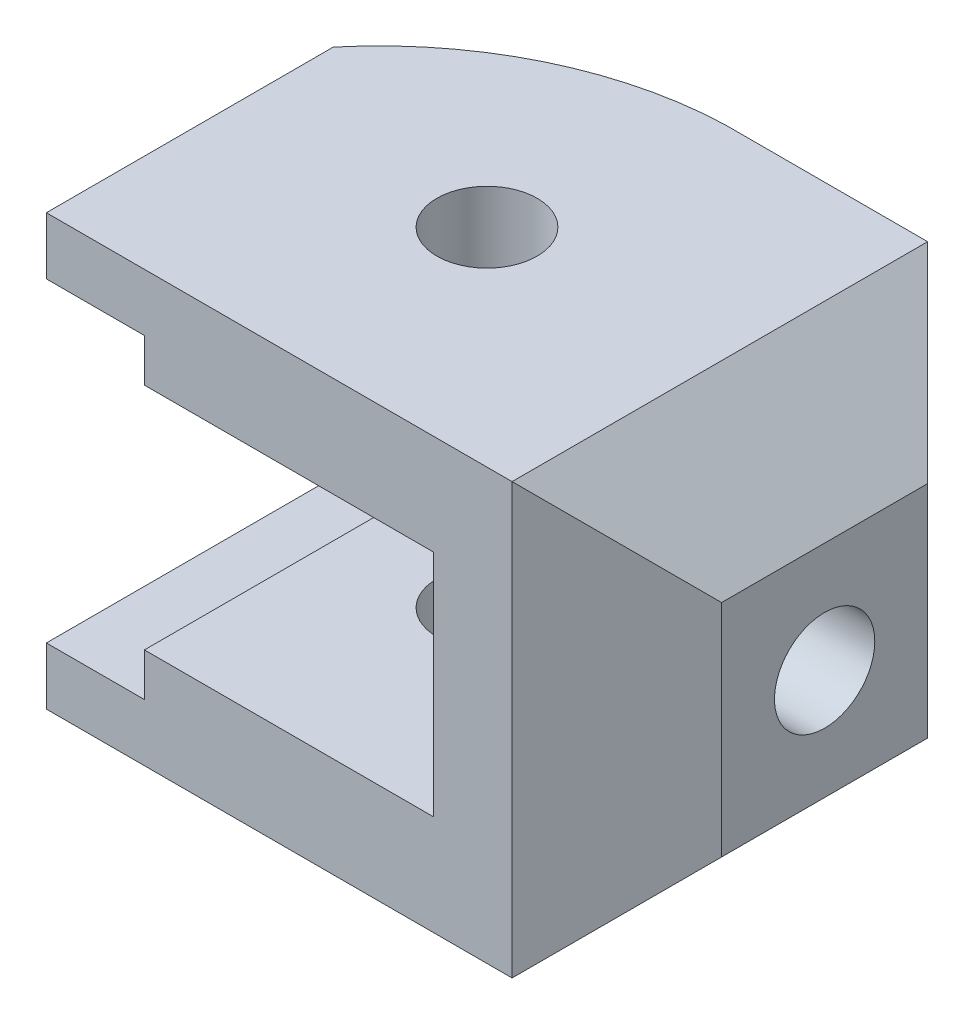
ISO-10303-21;
HEADER;
FILE_DESCRIPTION(('STEP AP214'),'2;1');
FILE_NAME('part.step','',(''),(''),'','','');
FILE_SCHEMA(('AUTOMOTIVE_DESIGN { 1 0 10303 214 1 1 1 1 }'));
ENDSEC;
DATA;
#1=APPLICATION_CONTEXT('core data for automotive mechanical design processes');
#2=APPLICATION_PROTOCOL_DEFINITION('international standard','automotive_design',2000,#1);
#3=PRODUCT_CONTEXT('',#1,'mechanical');
#4=PRODUCT('Part','Part','',(#3));
#5=PRODUCT_RELATED_PRODUCT_CATEGORY('part','',(#4));
#6=PRODUCT_DEFINITION_FORMATION('','',#4);
#7=PRODUCT_DEFINITION_CONTEXT('part definition',#1,'design');
#8=PRODUCT_DEFINITION('design','',#6,#7);
#9=PRODUCT_DEFINITION_SHAPE('','',#8);
#10=(LENGTH_UNIT() NAMED_UNIT(*) SI_UNIT(.MILLI.,.METRE.));
#11=(NAMED_UNIT(*) PLANE_ANGLE_UNIT() SI_UNIT($,.RADIAN.));
#12=(NAMED_UNIT(*) SI_UNIT($,.STERADIAN.) SOLID_ANGLE_UNIT());
#13=UNCERTAINTY_MEASURE_WITH_UNIT(LENGTH_MEASURE(1.E-05),#10,'distance_accuracy_value','');
#14=(GEOMETRIC_REPRESENTATION_CONTEXT(3) GLOBAL_UNCERTAINTY_ASSIGNED_CONTEXT((#13)) GLOBAL_UNIT_ASSIGNED_CONTEXT((#10,
#11,#12)) REPRESENTATION_CONTEXT('',''));
#15=CARTESIAN_POINT('',(0.,0.,0.));
#16=DIRECTION('',(0.,0.,1.));
#17=DIRECTION('',(1.,0.,0.));
#18=AXIS2_PLACEMENT_3D('',#15,#16,#17);
#19=CARTESIAN_POINT('',(65.,0.,58.));
#20=DIRECTION('',(-0.707106781186549,0.707106781186546,0.));
#21=DIRECTION('',(-0.707106781186546,-0.707106781186549,0.));
#22=AXIS2_PLACEMENT_3D('',#19,#20,#21);
#23=PLANE('',#22);
#24=DIRECTION('',(-0.577350269189627,-0.577350269189629,-0.577350269189621));
#25=VECTOR('',#24,1.);
#26=CARTESIAN_POINT('',(84.3333333333332,19.3333333333333,19.333333333333));
#27=LINE('',#26,#25);
#28=CARTESIAN_POINT('',(79.6214177277646,14.6214177277647,14.6214177277644));
#29=VERTEX_POINT('',#28);
#30=CARTESIAN_POINT('',(65.,0.,0.));
#31=VERTEX_POINT('',#30);
#32=EDGE_CURVE('E307',#29,#31,#27,.T.);
#33=ORIENTED_EDGE('',*,*,#32,.F.);
#34=DIRECTION('',(0.,0.,-1.));
#35=VECTOR('',#34,1.);
#36=CARTESIAN_POINT('',(79.6214177277646,14.6214177277647,58.));
#37=LINE('',#36,#35);
#38=CARTESIAN_POINT('',(79.6214177277646,14.6214177277647,43.3785822722356));
#39=VERTEX_POINT('',#38);
#40=EDGE_CURVE('E227',#39,#29,#37,.T.);
#41=ORIENTED_EDGE('',*,*,#40,.F.);
#42=DIRECTION('',(0.577350269189627,0.577350269189629,-0.577350269189621));
#43=VECTOR('',#42,1.);
#44=CARTESIAN_POINT('',(65.,0.,58.));
#45=LINE('',#44,#43);
#46=CARTESIAN_POINT('',(65.,0.,58.));
#47=VERTEX_POINT('',#46);
#48=EDGE_CURVE('E246',#47,#39,#45,.T.);
#49=ORIENTED_EDGE('',*,*,#48,.F.);
#50=DIRECTION('',(0.,0.,-1.));
#51=VECTOR('',#50,1.);
#52=CARTESIAN_POINT('',(65.,0.,58.));
#53=LINE('',#52,#51);
#54=EDGE_CURVE('E230',#47,#31,#53,.T.);
#55=ORIENTED_EDGE('',*,*,#54,.T.);
#56=EDGE_LOOP('',(#33,#41,#49,#55));
#57=FACE_BOUND('',#56,.T.);
#58=ADVANCED_FACE('F39',(#57),#23,.F.);
#59=CARTESIAN_POINT('',(79.6214177277646,14.6214177277647,58.));
#60=DIRECTION('',(-1.,0.,0.));
#61=DIRECTION('',(0.,0.,1.));
#62=AXIS2_PLACEMENT_3D('',#59,#60,#61);
#63=PLANE('',#62);
#64=CARTESIAN_POINT('',(79.6214177277646,30.,29.));
#65=DIRECTION('',(1.,0.,0.));
#66=DIRECTION('',(0.,0.,-1.));
#67=AXIS2_PLACEMENT_3D('',#64,#65,#66);
#68=CIRCLE('',#67,7.);
#69=CARTESIAN_POINT('',(79.6214177277646,30.,22.));
#70=VERTEX_POINT('',#69);
#71=EDGE_CURVE('E182',#70,#70,#68,.T.);
#72=ORIENTED_EDGE('',*,*,#71,.F.);
#73=EDGE_LOOP('',(#72));
#74=FACE_BOUND('',#73,.T.);
#75=DIRECTION('',(0.,-1.,0.));
#76=VECTOR('',#75,1.);
#77=CARTESIAN_POINT('',(79.6214177277646,60.,14.6214177277644));
#78=LINE('',#77,#76);
#79=CARTESIAN_POINT('',(79.6214177277646,45.3785822722354,14.6214177277644));
#80=VERTEX_POINT('',#79);
#81=EDGE_CURVE('E299',#80,#29,#78,.T.);
#82=ORIENTED_EDGE('',*,*,#81,.F.);
#83=DIRECTION('',(0.,0.,-1.));
#84=VECTOR('',#83,1.);
#85=CARTESIAN_POINT('',(79.6214177277646,45.3785822722354,58.));
#86=LINE('',#85,#84);
#87=CARTESIAN_POINT('',(79.6214177277646,45.3785822722354,43.3785822722356));
#88=VERTEX_POINT('',#87);
#89=EDGE_CURVE('E224',#88,#80,#86,.T.);
#90=ORIENTED_EDGE('',*,*,#89,.F.);
#91=DIRECTION('',(0.,-1.,0.));
#92=VECTOR('',#91,1.);
#93=CARTESIAN_POINT('',(79.6214177277646,60.,43.3785822722356));
#94=LINE('',#93,#92);
#95=EDGE_CURVE('E297',#88,#39,#94,.T.);
#96=ORIENTED_EDGE('',*,*,#95,.T.);
#97=ORIENTED_EDGE('',*,*,#40,.T.);
#98=EDGE_LOOP('',(#82,#90,#96,#97));
#99=FACE_BOUND('',#98,.T.);
#100=ADVANCED_FACE('F319',(#74,#99),#63,.F.);
#101=CARTESIAN_POINT('',(79.6214177277646,45.3785822722354,58.));
#102=DIRECTION('',(-0.707106781186549,-0.707106781186546,0.));
#103=DIRECTION('',(0.707106781186546,-0.707106781186549,0.));
#104=AXIS2_PLACEMENT_3D('',#101,#102,#103);
#105=PLANE('',#104);
#106=DIRECTION('',(0.577350269189627,-0.577350269189629,0.577350269189621));
#107=VECTOR('',#106,1.);
#108=CARTESIAN_POINT('',(94.0809451518431,30.9190548481569,29.0809451518427));
#109=LINE('',#108,#107);
#110=CARTESIAN_POINT('',(65.,60.,0.));
#111=VERTEX_POINT('',#110);
#112=EDGE_CURVE('E302',#111,#80,#109,.T.);
#113=ORIENTED_EDGE('',*,*,#112,.F.);
#114=DIRECTION('',(0.,0.,-1.));
#115=VECTOR('',#114,1.);
#116=CARTESIAN_POINT('',(65.,60.,58.));
#117=LINE('',#116,#115);
#118=CARTESIAN_POINT('',(65.,60.,58.));
#119=VERTEX_POINT('',#118);
#120=EDGE_CURVE('E221',#119,#111,#117,.T.);
#121=ORIENTED_EDGE('',*,*,#120,.F.);
#122=DIRECTION('',(-0.577350269189627,0.577350269189629,0.577350269189621));
#123=VECTOR('',#122,1.);
#124=CARTESIAN_POINT('',(74.7476118185098,50.2523881814902,48.2523881814903));
#125=LINE('',#124,#123);
#126=EDGE_CURVE('E308',#88,#119,#125,.T.);
#127=ORIENTED_EDGE('',*,*,#126,.F.);
#128=ORIENTED_EDGE('',*,*,#89,.T.);
#129=EDGE_LOOP('',(#113,#121,#127,#128));
#130=FACE_BOUND('',#129,.T.);
#131=ADVANCED_FACE('F325',(#130),#105,.F.);
#132=CARTESIAN_POINT('',(0.,0.,58.));
#133=DIRECTION('',(0.,0.,1.));
#134=DIRECTION('',(1.,0.,0.));
#135=AXIS2_PLACEMENT_3D('',#132,#133,#134);
#136=PLANE('',#135);
#137=DIRECTION('',(1.,0.,0.));
#138=VECTOR('',#137,1.);
#139=CARTESIAN_POINT('',(0.,0.,58.));
#140=LINE('',#139,#138);
#141=CARTESIAN_POINT('',(0.,0.,58.));
#142=VERTEX_POINT('',#141);
#143=EDGE_CURVE('E255',#142,#47,#140,.T.);
#144=ORIENTED_EDGE('',*,*,#143,.T.);
#145=DIRECTION('',(0.,-1.,0.));
#146=VECTOR('',#145,1.);
#147=CARTESIAN_POINT('',(65.,60.,58.));
#148=LINE('',#147,#146);
#149=EDGE_CURVE('E300',#119,#47,#148,.T.);
#150=ORIENTED_EDGE('',*,*,#149,.F.);
#151=DIRECTION('',(-1.,0.,0.));
#152=VECTOR('',#151,1.);
#153=CARTESIAN_POINT('',(65.,60.,58.));
#154=LINE('',#153,#152);
#155=CARTESIAN_POINT('',(0.,60.,58.));
#156=VERTEX_POINT('',#155);
#157=EDGE_CURVE('E258',#119,#156,#154,.T.);
#158=ORIENTED_EDGE('',*,*,#157,.T.);
#159=DIRECTION('',(0.,-1.,0.));
#160=VECTOR('',#159,1.);
#161=CARTESIAN_POINT('',(0.,60.,58.));
#162=LINE('',#161,#160);
#163=CARTESIAN_POINT('',(0.,52.,58.));
#164=VERTEX_POINT('',#163);
#165=EDGE_CURVE('E260',#156,#164,#162,.T.);
#166=ORIENTED_EDGE('',*,*,#165,.T.);
#167=DIRECTION('',(1.,0.,0.));
#168=VECTOR('',#167,1.);
#169=CARTESIAN_POINT('',(0.,52.,58.));
#170=LINE('',#169,#168);
#171=CARTESIAN_POINT('',(13.6860147119175,52.,58.));
#172=VERTEX_POINT('',#171);
#173=EDGE_CURVE('E262',#164,#172,#170,.T.);
#174=ORIENTED_EDGE('',*,*,#173,.T.);
#175=DIRECTION('',(0.,-1.,0.));
#176=VECTOR('',#175,1.);
#177=CARTESIAN_POINT('',(13.6860147119175,52.,58.));
#178=LINE('',#177,#176);
#179=CARTESIAN_POINT('',(13.6860147119175,46.,58.));
#180=VERTEX_POINT('',#179);
#181=EDGE_CURVE('E264',#172,#180,#178,.T.);
#182=ORIENTED_EDGE('',*,*,#181,.T.);
#183=DIRECTION('',(1.,0.,0.));
#184=VECTOR('',#183,1.);
#185=CARTESIAN_POINT('',(13.6860147119175,46.,58.));
#186=LINE('',#185,#184);
#187=CARTESIAN_POINT('',(54.,46.,58.));
#188=VERTEX_POINT('',#187);
#189=EDGE_CURVE('E266',#180,#188,#186,.T.);
#190=ORIENTED_EDGE('',*,*,#189,.T.);
#191=DIRECTION('',(0.,-1.,0.));
#192=VECTOR('',#191,1.);
#193=CARTESIAN_POINT('',(54.,46.,58.));
#194=LINE('',#193,#192);
#195=CARTESIAN_POINT('',(54.,14.,58.));
#196=VERTEX_POINT('',#195);
#197=EDGE_CURVE('E268',#188,#196,#194,.T.);
#198=ORIENTED_EDGE('',*,*,#197,.T.);
#199=DIRECTION('',(-1.,0.,0.));
#200=VECTOR('',#199,1.);
#201=CARTESIAN_POINT('',(54.,14.,58.));
#202=LINE('',#201,#200);
#203=CARTESIAN_POINT('',(13.6860147119175,14.,58.));
#204=VERTEX_POINT('',#203);
#205=EDGE_CURVE('E270',#196,#204,#202,.T.);
#206=ORIENTED_EDGE('',*,*,#205,.T.);
#207=DIRECTION('',(0.,-1.,0.));
#208=VECTOR('',#207,1.);
#209=CARTESIAN_POINT('',(13.6860147119175,14.,58.));
#210=LINE('',#209,#208);
#211=CARTESIAN_POINT('',(13.6860147119175,8.,58.));
#212=VERTEX_POINT('',#211);
#213=EDGE_CURVE('E271',#204,#212,#210,.T.);
#214=ORIENTED_EDGE('',*,*,#213,.T.);
#215=DIRECTION('',(-1.,0.,0.));
#216=VECTOR('',#215,1.);
#217=CARTESIAN_POINT('',(13.6860147119175,8.,58.));
#218=LINE('',#217,#216);
#219=CARTESIAN_POINT('',(0.,8.,58.));
#220=VERTEX_POINT('',#219);
#221=EDGE_CURVE('E185',#212,#220,#218,.T.);
#222=ORIENTED_EDGE('',*,*,#221,.T.);
#223=DIRECTION('',(0.,-1.,0.));
#224=VECTOR('',#223,1.);
#225=CARTESIAN_POINT('',(0.,8.,58.));
#226=LINE('',#225,#224);
#227=EDGE_CURVE('E193',#220,#142,#226,.T.);
#228=ORIENTED_EDGE('',*,*,#227,.T.);
#229=EDGE_LOOP('',(#144,#150,#158,#166,#174,#182,#190,#198,#206,#214,#222,#228));
#230=FACE_BOUND('',#229,.T.);
#231=ADVANCED_FACE('F277',(#230),#136,.T.);
#232=CARTESIAN_POINT('',(0.,0.,0.));
#233=DIRECTION('',(0.,0.,1.));
#234=DIRECTION('',(1.,0.,0.));
#235=AXIS2_PLACEMENT_3D('',#232,#233,#234);
#236=PLANE('',#235);
#237=DIRECTION('',(1.,0.,0.));
#238=VECTOR('',#237,1.);
#239=CARTESIAN_POINT('',(0.,0.,0.));
#240=LINE('',#239,#238);
#241=CARTESIAN_POINT('',(36.7163562797106,0.,0.));
#242=VERTEX_POINT('',#241);
#243=EDGE_CURVE('E165',#242,#31,#240,.T.);
#244=ORIENTED_EDGE('',*,*,#243,.F.);
#245=DIRECTION('',(0.,1.,0.));
#246=VECTOR('',#245,1.);
#247=CARTESIAN_POINT('',(36.7163562797106,0.,0.));
#248=LINE('',#247,#246);
#249=CARTESIAN_POINT('',(36.7163562797106,14.,0.));
#250=VERTEX_POINT('',#249);
#251=EDGE_CURVE('E149',#242,#250,#248,.T.);
#252=ORIENTED_EDGE('',*,*,#251,.T.);
#253=DIRECTION('',(-1.,0.,0.));
#254=VECTOR('',#253,1.);
#255=CARTESIAN_POINT('',(54.,14.,0.));
#256=LINE('',#255,#254);
#257=CARTESIAN_POINT('',(54.,14.,0.));
#258=VERTEX_POINT('',#257);
#259=EDGE_CURVE('E191',#258,#250,#256,.T.);
#260=ORIENTED_EDGE('',*,*,#259,.F.);
#261=DIRECTION('',(0.,-1.,0.));
#262=VECTOR('',#261,1.);
#263=CARTESIAN_POINT('',(54.,46.,0.));
#264=LINE('',#263,#262);
#265=CARTESIAN_POINT('',(54.,46.,0.));
#266=VERTEX_POINT('',#265);
#267=EDGE_CURVE('E189',#266,#258,#264,.T.);
#268=ORIENTED_EDGE('',*,*,#267,.F.);
#269=DIRECTION('',(1.,0.,0.));
#270=VECTOR('',#269,1.);
#271=CARTESIAN_POINT('',(13.6860147119175,46.,0.));
#272=LINE('',#271,#270);
#273=CARTESIAN_POINT('',(36.7163562797106,46.,0.));
#274=VERTEX_POINT('',#273);
#275=EDGE_CURVE('E179',#274,#266,#272,.T.);
#276=ORIENTED_EDGE('',*,*,#275,.F.);
#277=CARTESIAN_POINT('',(36.7163562797106,60.,0.));
#278=VERTEX_POINT('',#277);
#279=EDGE_CURVE('E54',#274,#278,#248,.T.);
#280=ORIENTED_EDGE('',*,*,#279,.T.);
#281=DIRECTION('',(-1.,0.,0.));
#282=VECTOR('',#281,1.);
#283=CARTESIAN_POINT('',(65.,60.,0.));
#284=LINE('',#283,#282);
#285=EDGE_CURVE('E175',#111,#278,#284,.T.);
#286=ORIENTED_EDGE('',*,*,#285,.F.);
#287=DIRECTION('',(0.,-1.,0.));
#288=VECTOR('',#287,1.);
#289=CARTESIAN_POINT('',(65.,60.,0.));
#290=LINE('',#289,#288);
#291=EDGE_CURVE('E173',#111,#31,#290,.T.);
#292=ORIENTED_EDGE('',*,*,#291,.T.);
#293=EDGE_LOOP('',(#244,#252,#260,#268,#276,#280,#286,#292));
#294=FACE_BOUND('',#293,.T.);
#295=ADVANCED_FACE('F171',(#294),#236,.F.);
#296=CARTESIAN_POINT('',(0.,8.,58.));
#297=DIRECTION('',(1.,0.,0.));
#298=DIRECTION('',(0.,1.,0.));
#299=AXIS2_PLACEMENT_3D('',#296,#297,#298);
#300=PLANE('',#299);
#301=DIRECTION('',(0.,0.,-1.));
#302=VECTOR('',#301,1.);
#303=CARTESIAN_POINT('',(0.,8.,58.));
#304=LINE('',#303,#302);
#305=CARTESIAN_POINT('',(0.,8.,17.9548803592759));
#306=VERTEX_POINT('',#305);
#307=EDGE_CURVE('E194',#220,#306,#304,.T.);
#308=ORIENTED_EDGE('',*,*,#307,.T.);
#309=DIRECTION('',(0.,1.,0.));
#310=VECTOR('',#309,1.);
#311=CARTESIAN_POINT('',(0.,0.,17.9548803592758));
#312=LINE('',#311,#310);
#313=CARTESIAN_POINT('',(0.,0.,17.9548803592758));
#314=VERTEX_POINT('',#313);
#315=EDGE_CURVE('E62',#314,#306,#312,.T.);
#316=ORIENTED_EDGE('',*,*,#315,.F.);
#317=DIRECTION('',(0.,0.,-1.));
#318=VECTOR('',#317,1.);
#319=CARTESIAN_POINT('',(0.,0.,58.));
#320=LINE('',#319,#318);
#321=EDGE_CURVE('E47',#142,#314,#320,.T.);
#322=ORIENTED_EDGE('',*,*,#321,.F.);
#323=ORIENTED_EDGE('',*,*,#227,.F.);
#324=EDGE_LOOP('',(#308,#316,#322,#323));
#325=FACE_BOUND('',#324,.T.);
#326=ADVANCED_FACE('F41',(#325),#300,.F.);
#327=CARTESIAN_POINT('',(0.,0.,58.));
#328=DIRECTION('',(0.,1.,0.));
#329=DIRECTION('',(0.,0.,1.));
#330=AXIS2_PLACEMENT_3D('',#327,#328,#329);
#331=PLANE('',#330);
#332=CARTESIAN_POINT('',(32.5,0.,29.));
#333=DIRECTION('',(0.,1.,0.));
#334=DIRECTION('',(-1.,0.,0.));
#335=AXIS2_PLACEMENT_3D('',#332,#333,#334);
#336=CIRCLE('',#335,7.);
#337=CARTESIAN_POINT('',(25.5,0.,29.));
#338=VERTEX_POINT('',#337);
#339=EDGE_CURVE('E235',#338,#338,#336,.T.);
#340=ORIENTED_EDGE('',*,*,#339,.T.);
#341=EDGE_LOOP('',(#340));
#342=FACE_BOUND('',#341,.T.);
#343=ORIENTED_EDGE('',*,*,#321,.T.);
#344=CARTESIAN_POINT('',(38.4049133849402,0.,49.9714796149001));
#345=DIRECTION('',(0.,-1.,0.));
#346=DIRECTION('',(1.,0.,0.));
#347=AXIS2_PLACEMENT_3D('',#344,#345,#346);
#348=CIRCLE('',#347,50.);
#349=EDGE_CURVE('E152',#314,#242,#348,.T.);
#350=ORIENTED_EDGE('',*,*,#349,.T.);
#351=ORIENTED_EDGE('',*,*,#243,.T.);
#352=ORIENTED_EDGE('',*,*,#54,.F.);
#353=ORIENTED_EDGE('',*,*,#143,.F.);
#354=EDGE_LOOP('',(#343,#350,#351,#352,#353));
#355=FACE_BOUND('',#354,.T.);
#356=ADVANCED_FACE('F163',(#342,#355),#331,.F.);
#357=CARTESIAN_POINT('',(65.,60.,58.));
#358=DIRECTION('',(0.,-1.,0.));
#359=DIRECTION('',(1.,0.,0.));
#360=AXIS2_PLACEMENT_3D('',#357,#358,#359);
#361=PLANE('',#360);
#362=CARTESIAN_POINT('',(32.5,60.,29.));
#363=DIRECTION('',(0.,1.,0.));
#364=DIRECTION('',(-1.,0.,0.));
#365=AXIS2_PLACEMENT_3D('',#362,#363,#364);
#366=CIRCLE('',#365,7.);
#367=CARTESIAN_POINT('',(25.5,60.,29.));
#368=VERTEX_POINT('',#367);
#369=EDGE_CURVE('E241',#368,#368,#366,.T.);
#370=ORIENTED_EDGE('',*,*,#369,.F.);
#371=EDGE_LOOP('',(#370));
#372=FACE_BOUND('',#371,.T.);
#373=ORIENTED_EDGE('',*,*,#285,.T.);
#374=CARTESIAN_POINT('',(38.4049133849402,60.,49.9714796149001));
#375=DIRECTION('',(0.,-1.,0.));
#376=DIRECTION('',(1.,0.,0.));
#377=AXIS2_PLACEMENT_3D('',#374,#375,#376);
#378=CIRCLE('',#377,50.);
#379=CARTESIAN_POINT('',(0.,60.,17.9548803592758));
#380=VERTEX_POINT('',#379);
#381=EDGE_CURVE('E168',#380,#278,#378,.T.);
#382=ORIENTED_EDGE('',*,*,#381,.F.);
#383=DIRECTION('',(0.,0.,-1.));
#384=VECTOR('',#383,1.);
#385=CARTESIAN_POINT('',(0.,60.,58.));
#386=LINE('',#385,#384);
#387=EDGE_CURVE('E218',#156,#380,#386,.T.);
#388=ORIENTED_EDGE('',*,*,#387,.F.);
#389=ORIENTED_EDGE('',*,*,#157,.F.);
#390=ORIENTED_EDGE('',*,*,#120,.T.);
#391=EDGE_LOOP('',(#373,#382,#388,#389,#390));
#392=FACE_BOUND('',#391,.T.);
#393=ADVANCED_FACE('F330',(#372,#392),#361,.F.);
#394=CARTESIAN_POINT('',(0.,60.,58.));
#395=DIRECTION('',(1.,0.,0.));
#396=DIRECTION('',(0.,1.,0.));
#397=AXIS2_PLACEMENT_3D('',#394,#395,#396);
#398=PLANE('',#397);
#399=ORIENTED_EDGE('',*,*,#387,.T.);
#400=CARTESIAN_POINT('',(0.,52.,17.9548803592758));
#401=VERTEX_POINT('',#400);
#402=EDGE_CURVE('E159',#401,#380,#312,.T.);
#403=ORIENTED_EDGE('',*,*,#402,.F.);
#404=DIRECTION('',(0.,0.,-1.));
#405=VECTOR('',#404,1.);
#406=CARTESIAN_POINT('',(0.,52.,58.));
#407=LINE('',#406,#405);
#408=EDGE_CURVE('E215',#164,#401,#407,.T.);
#409=ORIENTED_EDGE('',*,*,#408,.F.);
#410=ORIENTED_EDGE('',*,*,#165,.F.);
#411=EDGE_LOOP('',(#399,#403,#409,#410));
#412=FACE_BOUND('',#411,.T.);
#413=ADVANCED_FACE('F338',(#412),#398,.F.);
#414=CARTESIAN_POINT('',(0.,52.,58.));
#415=DIRECTION('',(0.,1.,0.));
#416=DIRECTION('',(0.,0.,1.));
#417=AXIS2_PLACEMENT_3D('',#414,#415,#416);
#418=PLANE('',#417);
#419=ORIENTED_EDGE('',*,*,#408,.T.);
#420=CARTESIAN_POINT('',(38.4049133849402,52.,49.9714796149001));
#421=DIRECTION('',(0.,1.,0.));
#422=DIRECTION('',(0.,0.,1.));
#423=AXIS2_PLACEMENT_3D('',#420,#421,#422);
#424=CIRCLE('',#423,50.);
#425=CARTESIAN_POINT('',(13.6860147119175,52.,6.50912753412986));
#426=VERTEX_POINT('',#425);
#427=EDGE_CURVE('E294',#401,#426,#424,.F.);
#428=ORIENTED_EDGE('',*,*,#427,.T.);
#429=DIRECTION('',(0.,0.,-1.));
#430=VECTOR('',#429,1.);
#431=CARTESIAN_POINT('',(13.6860147119175,52.,58.));
#432=LINE('',#431,#430);
#433=EDGE_CURVE('E212',#172,#426,#432,.T.);
#434=ORIENTED_EDGE('',*,*,#433,.F.);
#435=ORIENTED_EDGE('',*,*,#173,.F.);
#436=EDGE_LOOP('',(#419,#428,#434,#435));
#437=FACE_BOUND('',#436,.T.);
#438=ADVANCED_FACE('F340',(#437),#418,.F.);
#439=CARTESIAN_POINT('',(13.6860147119175,52.,58.));
#440=DIRECTION('',(1.,0.,0.));
#441=DIRECTION('',(0.,0.,-1.));
#442=AXIS2_PLACEMENT_3D('',#439,#440,#441);
#443=PLANE('',#442);
#444=ORIENTED_EDGE('',*,*,#433,.T.);
#445=DIRECTION('',(0.,1.,0.));
#446=VECTOR('',#445,1.);
#447=CARTESIAN_POINT('',(13.6860147119175,0.,6.50912753412986));
#448=LINE('',#447,#446);
#449=CARTESIAN_POINT('',(13.6860147119175,46.,6.50912753412985));
#450=VERTEX_POINT('',#449);
#451=EDGE_CURVE('E291',#426,#450,#448,.F.);
#452=ORIENTED_EDGE('',*,*,#451,.T.);
#453=DIRECTION('',(0.,0.,-1.));
#454=VECTOR('',#453,1.);
#455=CARTESIAN_POINT('',(13.6860147119175,46.,58.));
#456=LINE('',#455,#454);
#457=EDGE_CURVE('E209',#180,#450,#456,.T.);
#458=ORIENTED_EDGE('',*,*,#457,.F.);
#459=ORIENTED_EDGE('',*,*,#181,.F.);
#460=EDGE_LOOP('',(#444,#452,#458,#459));
#461=FACE_BOUND('',#460,.T.);
#462=ADVANCED_FACE('F344',(#461),#443,.F.);
#463=CARTESIAN_POINT('',(13.6860147119175,46.,58.));
#464=DIRECTION('',(0.,1.,0.));
#465=DIRECTION('',(0.,0.,1.));
#466=AXIS2_PLACEMENT_3D('',#463,#464,#465);
#467=PLANE('',#466);
#468=CARTESIAN_POINT('',(32.5,46.,29.));
#469=DIRECTION('',(0.,1.,0.));
#470=DIRECTION('',(0.,0.,1.));
#471=AXIS2_PLACEMENT_3D('',#468,#469,#470);
#472=CIRCLE('',#471,7.);
#473=CARTESIAN_POINT('',(25.5,46.,29.));
#474=VERTEX_POINT('',#473);
#475=EDGE_CURVE('E234',#474,#474,#472,.T.);
#476=ORIENTED_EDGE('',*,*,#475,.T.);
#477=EDGE_LOOP('',(#476));
#478=FACE_BOUND('',#477,.T.);
#479=ORIENTED_EDGE('',*,*,#457,.T.);
#480=CARTESIAN_POINT('',(38.4049133849402,46.,49.9714796149001));
#481=DIRECTION('',(0.,1.,0.));
#482=DIRECTION('',(0.,0.,1.));
#483=AXIS2_PLACEMENT_3D('',#480,#481,#482);
#484=CIRCLE('',#483,50.);
#485=EDGE_CURVE('E289',#450,#274,#484,.F.);
#486=ORIENTED_EDGE('',*,*,#485,.T.);
#487=ORIENTED_EDGE('',*,*,#275,.T.);
#488=DIRECTION('',(0.,0.,-1.));
#489=VECTOR('',#488,1.);
#490=CARTESIAN_POINT('',(54.,46.,58.));
#491=LINE('',#490,#489);
#492=EDGE_CURVE('E206',#188,#266,#491,.T.);
#493=ORIENTED_EDGE('',*,*,#492,.F.);
#494=ORIENTED_EDGE('',*,*,#189,.F.);
#495=EDGE_LOOP('',(#479,#486,#487,#493,#494));
#496=FACE_BOUND('',#495,.T.);
#497=ADVANCED_FACE('F350',(#478,#496),#467,.F.);
#498=CARTESIAN_POINT('',(54.,46.,58.));
#499=DIRECTION('',(1.,0.,0.));
#500=DIRECTION('',(0.,0.,-1.));
#501=AXIS2_PLACEMENT_3D('',#498,#499,#500);
#502=PLANE('',#501);
#503=CARTESIAN_POINT('',(54.,30.,29.));
#504=DIRECTION('',(1.,0.,0.));
#505=DIRECTION('',(0.,0.,-1.));
#506=AXIS2_PLACEMENT_3D('',#503,#504,#505);
#507=CIRCLE('',#506,7.);
#508=CARTESIAN_POINT('',(54.,30.,22.));
#509=VERTEX_POINT('',#508);
#510=EDGE_CURVE('E176',#509,#509,#507,.T.);
#511=ORIENTED_EDGE('',*,*,#510,.T.);
#512=EDGE_LOOP('',(#511));
#513=FACE_BOUND('',#512,.T.);
#514=ORIENTED_EDGE('',*,*,#267,.T.);
#515=DIRECTION('',(0.,0.,-1.));
#516=VECTOR('',#515,1.);
#517=CARTESIAN_POINT('',(54.,14.,58.));
#518=LINE('',#517,#516);
#519=EDGE_CURVE('E203',#196,#258,#518,.T.);
#520=ORIENTED_EDGE('',*,*,#519,.F.);
#521=ORIENTED_EDGE('',*,*,#197,.F.);
#522=ORIENTED_EDGE('',*,*,#492,.T.);
#523=EDGE_LOOP('',(#514,#520,#521,#522));
#524=FACE_BOUND('',#523,.T.);
#525=ADVANCED_FACE('F354',(#513,#524),#502,.F.);
#526=CARTESIAN_POINT('',(54.,14.,58.));
#527=DIRECTION('',(0.,-1.,0.));
#528=DIRECTION('',(1.,0.,0.));
#529=AXIS2_PLACEMENT_3D('',#526,#527,#528);
#530=PLANE('',#529);
#531=CARTESIAN_POINT('',(32.5,14.,29.));
#532=DIRECTION('',(0.,-1.,0.));
#533=DIRECTION('',(1.,0.,0.));
#534=AXIS2_PLACEMENT_3D('',#531,#532,#533);
#535=CIRCLE('',#534,7.);
#536=CARTESIAN_POINT('',(25.5,14.,29.));
#537=VERTEX_POINT('',#536);
#538=EDGE_CURVE('E232',#537,#537,#535,.T.);
#539=ORIENTED_EDGE('',*,*,#538,.T.);
#540=EDGE_LOOP('',(#539));
#541=FACE_BOUND('',#540,.T.);
#542=ORIENTED_EDGE('',*,*,#259,.T.);
#543=CARTESIAN_POINT('',(38.4049133849402,14.,49.9714796149001));
#544=DIRECTION('',(0.,-1.,0.));
#545=DIRECTION('',(1.,0.,0.));
#546=AXIS2_PLACEMENT_3D('',#543,#544,#545);
#547=CIRCLE('',#546,50.);
#548=CARTESIAN_POINT('',(13.6860147119175,14.,6.50912753412985));
#549=VERTEX_POINT('',#548);
#550=EDGE_CURVE('E154',#250,#549,#547,.F.);
#551=ORIENTED_EDGE('',*,*,#550,.T.);
#552=DIRECTION('',(0.,0.,-1.));
#553=VECTOR('',#552,1.);
#554=CARTESIAN_POINT('',(13.6860147119175,14.,58.));
#555=LINE('',#554,#553);
#556=EDGE_CURVE('E200',#204,#549,#555,.T.);
#557=ORIENTED_EDGE('',*,*,#556,.F.);
#558=ORIENTED_EDGE('',*,*,#205,.F.);
#559=ORIENTED_EDGE('',*,*,#519,.T.);
#560=EDGE_LOOP('',(#542,#551,#557,#558,#559));
#561=FACE_BOUND('',#560,.T.);
#562=ADVANCED_FACE('F358',(#541,#561),#530,.F.);
#563=CARTESIAN_POINT('',(13.6860147119175,14.,58.));
#564=DIRECTION('',(1.,0.,0.));
#565=DIRECTION('',(0.,0.,-1.));
#566=AXIS2_PLACEMENT_3D('',#563,#564,#565);
#567=PLANE('',#566);
#568=ORIENTED_EDGE('',*,*,#556,.T.);
#569=DIRECTION('',(0.,1.,0.));
#570=VECTOR('',#569,1.);
#571=CARTESIAN_POINT('',(13.6860147119175,0.,6.50912753412985));
#572=LINE('',#571,#570);
#573=CARTESIAN_POINT('',(13.6860147119175,8.,6.50912753412985));
#574=VERTEX_POINT('',#573);
#575=EDGE_CURVE('E282',#549,#574,#572,.F.);
#576=ORIENTED_EDGE('',*,*,#575,.T.);
#577=DIRECTION('',(0.,0.,-1.));
#578=VECTOR('',#577,1.);
#579=CARTESIAN_POINT('',(13.6860147119175,8.,58.));
#580=LINE('',#579,#578);
#581=EDGE_CURVE('E197',#212,#574,#580,.T.);
#582=ORIENTED_EDGE('',*,*,#581,.F.);
#583=ORIENTED_EDGE('',*,*,#213,.F.);
#584=EDGE_LOOP('',(#568,#576,#582,#583));
#585=FACE_BOUND('',#584,.T.);
#586=ADVANCED_FACE('F360',(#585),#567,.F.);
#587=CARTESIAN_POINT('',(13.6860147119175,8.,58.));
#588=DIRECTION('',(0.,-1.,0.));
#589=DIRECTION('',(1.,0.,0.));
#590=AXIS2_PLACEMENT_3D('',#587,#588,#589);
#591=PLANE('',#590);
#592=ORIENTED_EDGE('',*,*,#581,.T.);
#593=CARTESIAN_POINT('',(38.4049133849402,8.,49.9714796149001));
#594=DIRECTION('',(0.,-1.,0.));
#595=DIRECTION('',(1.,0.,0.));
#596=AXIS2_PLACEMENT_3D('',#593,#594,#595);
#597=CIRCLE('',#596,50.);
#598=EDGE_CURVE('E11',#574,#306,#597,.F.);
#599=ORIENTED_EDGE('',*,*,#598,.T.);
#600=ORIENTED_EDGE('',*,*,#307,.F.);
#601=ORIENTED_EDGE('',*,*,#221,.F.);
#602=EDGE_LOOP('',(#592,#599,#600,#601));
#603=FACE_BOUND('',#602,.T.);
#604=ADVANCED_FACE('F280',(#603),#591,.F.);
#605=CARTESIAN_POINT('',(0.,30.,29.));
#606=DIRECTION('',(1.,0.,0.));
#607=DIRECTION('',(0.,0.,-1.));
#608=AXIS2_PLACEMENT_3D('',#605,#606,#607);
#609=CYLINDRICAL_SURFACE('',#608,7.);
#610=ORIENTED_EDGE('',*,*,#71,.T.);
#611=EDGE_LOOP('',(#610));
#612=FACE_BOUND('',#611,.T.);
#613=ORIENTED_EDGE('',*,*,#510,.F.);
#614=EDGE_LOOP('',(#613));
#615=FACE_BOUND('',#614,.T.);
#616=ADVANCED_FACE('F367',(#612,#615),#609,.F.);
#617=CARTESIAN_POINT('',(32.5,0.,29.));
#618=DIRECTION('',(0.,1.,0.));
#619=DIRECTION('',(-1.,0.,0.));
#620=AXIS2_PLACEMENT_3D('',#617,#618,#619);
#621=CYLINDRICAL_SURFACE('',#620,7.);
#622=CARTESIAN_POINT('',(25.5,0.,29.));
#623=CARTESIAN_POINT('',(25.5,0.145833333333326,29.));
#624=CARTESIAN_POINT('',(25.5,0.291666666666659,29.));
#625=CARTESIAN_POINT('',(25.5,0.583333333333326,29.));
#626=CARTESIAN_POINT('',(25.5,0.72916666666666,29.));
#627=CARTESIAN_POINT('',(25.5,1.02083333333333,29.));
#628=CARTESIAN_POINT('',(25.5,1.16666666666666,29.));
#629=CARTESIAN_POINT('',(25.5,1.45833333333333,29.));
#630=CARTESIAN_POINT('',(25.5,1.60416666666666,29.));
#631=CARTESIAN_POINT('',(25.5,1.89583333333333,29.));
#632=CARTESIAN_POINT('',(25.5,2.04166666666666,29.));
#633=CARTESIAN_POINT('',(25.5,2.33333333333333,29.));
#634=CARTESIAN_POINT('',(25.5,2.47916666666666,29.));
#635=CARTESIAN_POINT('',(25.5,2.77083333333333,29.));
#636=CARTESIAN_POINT('',(25.5,2.91666666666666,29.));
#637=CARTESIAN_POINT('',(25.5,3.20833333333333,29.));
#638=CARTESIAN_POINT('',(25.5,3.35416666666666,29.));
#639=CARTESIAN_POINT('',(25.5,3.64583333333333,29.));
#640=CARTESIAN_POINT('',(25.5,3.79166666666666,29.));
#641=CARTESIAN_POINT('',(25.5,4.08333333333333,29.));
#642=CARTESIAN_POINT('',(25.5,4.22916666666666,29.));
#643=CARTESIAN_POINT('',(25.5,4.52083333333333,29.));
#644=CARTESIAN_POINT('',(25.5,4.66666666666666,29.));
#645=CARTESIAN_POINT('',(25.5,4.95833333333333,29.));
#646=CARTESIAN_POINT('',(25.5,5.10416666666666,29.));
#647=CARTESIAN_POINT('',(25.5,5.39583333333333,29.));
#648=CARTESIAN_POINT('',(25.5,5.54166666666666,29.));
#649=CARTESIAN_POINT('',(25.5,5.83333333333333,29.));
#650=CARTESIAN_POINT('',(25.5,5.97916666666666,29.));
#651=CARTESIAN_POINT('',(25.5,6.27083333333333,29.));
#652=CARTESIAN_POINT('',(25.5,6.41666666666666,29.));
#653=CARTESIAN_POINT('',(25.5,6.70833333333333,29.));
#654=CARTESIAN_POINT('',(25.5,6.85416666666666,29.));
#655=CARTESIAN_POINT('',(25.5,7.14583333333333,29.));
#656=CARTESIAN_POINT('',(25.5,7.29166666666666,29.));
#657=CARTESIAN_POINT('',(25.5,7.58333333333333,29.));
#658=CARTESIAN_POINT('',(25.5,7.72916666666666,29.));
#659=CARTESIAN_POINT('',(25.5,8.02083333333333,29.));
#660=CARTESIAN_POINT('',(25.5,8.16666666666667,29.));
#661=CARTESIAN_POINT('',(25.5,8.45833333333333,29.));
#662=CARTESIAN_POINT('',(25.5,8.60416666666667,29.));
#663=CARTESIAN_POINT('',(25.5,8.89583333333333,29.));
#664=CARTESIAN_POINT('',(25.5,9.04166666666667,29.));
#665=CARTESIAN_POINT('',(25.5,9.33333333333333,29.));
#666=CARTESIAN_POINT('',(25.5,9.47916666666667,29.));
#667=CARTESIAN_POINT('',(25.5,9.77083333333333,29.));
#668=CARTESIAN_POINT('',(25.5,9.91666666666667,29.));
#669=CARTESIAN_POINT('',(25.5,10.2083333333333,29.));
#670=CARTESIAN_POINT('',(25.5,10.3541666666667,29.));
#671=CARTESIAN_POINT('',(25.5,10.6458333333333,29.));
#672=CARTESIAN_POINT('',(25.5,10.7916666666667,29.));
#673=CARTESIAN_POINT('',(25.5,11.0833333333333,29.));
#674=CARTESIAN_POINT('',(25.5,11.2291666666667,29.));
#675=CARTESIAN_POINT('',(25.5,11.5208333333333,29.));
#676=CARTESIAN_POINT('',(25.5,11.6666666666667,29.));
#677=CARTESIAN_POINT('',(25.5,11.9583333333333,29.));
#678=CARTESIAN_POINT('',(25.5,12.1041666666667,29.));
#679=CARTESIAN_POINT('',(25.5,12.3958333333333,29.));
#680=CARTESIAN_POINT('',(25.5,12.5416666666667,29.));
#681=CARTESIAN_POINT('',(25.5,12.8333333333333,29.));
#682=CARTESIAN_POINT('',(25.5,12.9791666666667,29.));
#683=CARTESIAN_POINT('',(25.5,13.2708333333333,29.));
#684=CARTESIAN_POINT('',(25.5,13.4166666666667,29.));
#685=CARTESIAN_POINT('',(25.5,13.7083333333333,29.));
#686=CARTESIAN_POINT('',(25.5,13.8541666666667,29.));
#687=CARTESIAN_POINT('',(25.5,14.,29.));
#688=B_SPLINE_CURVE_WITH_KNOTS('',3,(#622,#623,#624,#625,#626,#627,#628,#629,#630,#631,#632,
#633,#634,#635,#636,#637,#638,#639,#640,#641,#642,#643,#644,#645,#646,#647,#648,#649,#650,#651,
#652,#653,#654,#655,#656,#657,#658,#659,#660,#661,#662,#663,#664,#665,#666,#667,#668,#669,#670,
#671,#672,#673,#674,#675,#676,#677,#678,#679,#680,#681,#682,#683,#684,#685,#686,#687),
.UNSPECIFIED.,.F.,.F.,(4,2,2,2,2,2,2,2,2,2,2,2,2,2,2,2,2,2,2,2,2,2,2,2,2,2,2,2,2,2,2,2,4),(0.,
0.4375,0.875000000000001,1.3125,1.75,2.1875,2.625,3.0625,3.5,3.9375,4.375,4.8125,5.25,5.6875,
6.125,6.56250000000001,7.00000000000001,7.43750000000001,7.87500000000001,8.31250000000001,
8.75000000000001,9.18750000000001,9.62500000000001,10.0625,10.5,10.9375,11.375,11.8125,12.25,
12.6875,13.125,13.5625,14.),.UNSPECIFIED.);
#689=EDGE_CURVE('BSEAM398',#338,#537,#688,.T.);
#690=ORIENTED_EDGE('',*,*,#339,.F.);
#691=ORIENTED_EDGE('',*,*,#538,.F.);
#692=ORIENTED_EDGE('',*,*,#689,.T.);
#693=ORIENTED_EDGE('',*,*,#689,.F.);
#694=EDGE_LOOP('',(#690,#692,#691,#693));
#695=FACE_BOUND('',#694,.T.);
#696=ADVANCED_FACE('F398',(#695),#621,.F.);
#697=CARTESIAN_POINT('',(25.5,60.,29.));
#698=CARTESIAN_POINT('',(25.5,59.8541666666667,29.));
#699=CARTESIAN_POINT('',(25.5,59.7083333333333,29.));
#700=CARTESIAN_POINT('',(25.5,59.4166666666667,29.));
#701=CARTESIAN_POINT('',(25.5,59.2708333333333,29.));
#702=CARTESIAN_POINT('',(25.5,58.9791666666667,29.));
#703=CARTESIAN_POINT('',(25.5,58.8333333333333,29.));
#704=CARTESIAN_POINT('',(25.5,58.5416666666667,29.));
#705=CARTESIAN_POINT('',(25.5,58.3958333333333,29.));
#706=CARTESIAN_POINT('',(25.5,58.1041666666667,29.));
#707=CARTESIAN_POINT('',(25.5,57.9583333333333,29.));
#708=CARTESIAN_POINT('',(25.5,57.6666666666667,29.));
#709=CARTESIAN_POINT('',(25.5,57.5208333333333,29.));
#710=CARTESIAN_POINT('',(25.5,57.2291666666667,29.));
#711=CARTESIAN_POINT('',(25.5,57.0833333333333,29.));
#712=CARTESIAN_POINT('',(25.5,56.7916666666667,29.));
#713=CARTESIAN_POINT('',(25.5,56.6458333333333,29.));
#714=CARTESIAN_POINT('',(25.5,56.3541666666667,29.));
#715=CARTESIAN_POINT('',(25.5,56.2083333333333,29.));
#716=CARTESIAN_POINT('',(25.5,55.9166666666667,29.));
#717=CARTESIAN_POINT('',(25.5,55.7708333333333,29.));
#718=CARTESIAN_POINT('',(25.5,55.4791666666667,29.));
#719=CARTESIAN_POINT('',(25.5,55.3333333333333,29.));
#720=CARTESIAN_POINT('',(25.5,55.0416666666667,29.));
#721=CARTESIAN_POINT('',(25.5,54.8958333333333,29.));
#722=CARTESIAN_POINT('',(25.5,54.6041666666667,29.));
#723=CARTESIAN_POINT('',(25.5,54.4583333333333,29.));
#724=CARTESIAN_POINT('',(25.5,54.1666666666667,29.));
#725=CARTESIAN_POINT('',(25.5,54.0208333333333,29.));
#726=CARTESIAN_POINT('',(25.5,53.7291666666667,29.));
#727=CARTESIAN_POINT('',(25.5,53.5833333333333,29.));
#728=CARTESIAN_POINT('',(25.5,53.2916666666667,29.));
#729=CARTESIAN_POINT('',(25.5,53.1458333333333,29.));
#730=CARTESIAN_POINT('',(25.5,52.8541666666667,29.));
#731=CARTESIAN_POINT('',(25.5,52.7083333333333,29.));
#732=CARTESIAN_POINT('',(25.5,52.4166666666667,29.));
#733=CARTESIAN_POINT('',(25.5,52.2708333333333,29.));
#734=CARTESIAN_POINT('',(25.5,51.9791666666667,29.));
#735=CARTESIAN_POINT('',(25.5,51.8333333333333,29.));
#736=CARTESIAN_POINT('',(25.5,51.5416666666667,29.));
#737=CARTESIAN_POINT('',(25.5,51.3958333333333,29.));
#738=CARTESIAN_POINT('',(25.5,51.1041666666667,29.));
#739=CARTESIAN_POINT('',(25.5,50.9583333333333,29.));
#740=CARTESIAN_POINT('',(25.5,50.6666666666667,29.));
#741=CARTESIAN_POINT('',(25.5,50.5208333333333,29.));
#742=CARTESIAN_POINT('',(25.5,50.2291666666667,29.));
#743=CARTESIAN_POINT('',(25.5,50.0833333333333,29.));
#744=CARTESIAN_POINT('',(25.5,49.7916666666667,29.));
#745=CARTESIAN_POINT('',(25.5,49.6458333333333,29.));
#746=CARTESIAN_POINT('',(25.5,49.3541666666667,29.));
#747=CARTESIAN_POINT('',(25.5,49.2083333333333,29.));
#748=CARTESIAN_POINT('',(25.5,48.9166666666667,29.));
#749=CARTESIAN_POINT('',(25.5,48.7708333333333,29.));
#750=CARTESIAN_POINT('',(25.5,48.4791666666667,29.));
#751=CARTESIAN_POINT('',(25.5,48.3333333333333,29.));
#752=CARTESIAN_POINT('',(25.5,48.0416666666667,29.));
#753=CARTESIAN_POINT('',(25.5,47.8958333333333,29.));
#754=CARTESIAN_POINT('',(25.5,47.6041666666667,29.));
#755=CARTESIAN_POINT('',(25.5,47.4583333333333,29.));
#756=CARTESIAN_POINT('',(25.5,47.1666666666667,29.));
#757=CARTESIAN_POINT('',(25.5,47.0208333333333,29.));
#758=CARTESIAN_POINT('',(25.5,46.7291666666667,29.));
#759=CARTESIAN_POINT('',(25.5,46.5833333333333,29.));
#760=CARTESIAN_POINT('',(25.5,46.2916666666667,29.));
#761=CARTESIAN_POINT('',(25.5,46.1458333333333,29.));
#762=CARTESIAN_POINT('',(25.5,46.,29.));
#763=B_SPLINE_CURVE_WITH_KNOTS('',3,(#697,#698,#699,#700,#701,#702,#703,#704,#705,#706,#707,
#708,#709,#710,#711,#712,#713,#714,#715,#716,#717,#718,#719,#720,#721,#722,#723,#724,#725,#726,
#727,#728,#729,#730,#731,#732,#733,#734,#735,#736,#737,#738,#739,#740,#741,#742,#743,#744,#745,
#746,#747,#748,#749,#750,#751,#752,#753,#754,#755,#756,#757,#758,#759,#760,#761,#762),
.UNSPECIFIED.,.F.,.F.,(4,2,2,2,2,2,2,2,2,2,2,2,2,2,2,2,2,2,2,2,2,2,2,2,2,2,2,2,2,2,2,2,4),(0.,
0.4375,0.875000000000001,1.3125,1.75,2.1875,2.625,3.0625,3.5,3.9375,4.375,4.8125,5.25,
5.68750000000001,6.12500000000001,6.56250000000001,7.00000000000001,7.43750000000001,
7.87500000000001,8.31250000000001,8.75000000000001,9.18750000000001,9.62500000000001,10.0625,
10.5,10.9375,11.375,11.8125,12.25,12.6875,13.125,13.5625,14.),.UNSPECIFIED.);
#764=EDGE_CURVE('BSEAM400',#368,#474,#763,.T.);
#765=ORIENTED_EDGE('',*,*,#369,.T.);
#766=ORIENTED_EDGE('',*,*,#475,.F.);
#767=ORIENTED_EDGE('',*,*,#764,.T.);
#768=ORIENTED_EDGE('',*,*,#764,.F.);
#769=EDGE_LOOP('',(#765,#767,#766,#768));
#770=FACE_BOUND('',#769,.T.);
#771=ADVANCED_FACE('F400',(#770),#621,.F.);
#772=CARTESIAN_POINT('',(79.6214177277646,60.,14.6214177277644));
#773=DIRECTION('',(0.707106781186544,0.,-0.707106781186551));
#774=DIRECTION('',(-0.707106781186551,0.,-0.707106781186544));
#775=AXIS2_PLACEMENT_3D('',#772,#773,#774);
#776=PLANE('',#775);
#777=ORIENTED_EDGE('',*,*,#32,.T.);
#778=ORIENTED_EDGE('',*,*,#291,.F.);
#779=ORIENTED_EDGE('',*,*,#112,.T.);
#780=ORIENTED_EDGE('',*,*,#81,.T.);
#781=EDGE_LOOP('',(#777,#778,#779,#780));
#782=FACE_BOUND('',#781,.T.);
#783=ADVANCED_FACE('F322',(#782),#776,.T.);
#784=CARTESIAN_POINT('',(65.,60.,58.));
#785=DIRECTION('',(0.707106781186544,0.,0.707106781186551));
#786=DIRECTION('',(0.707106781186551,0.,-0.707106781186544));
#787=AXIS2_PLACEMENT_3D('',#784,#785,#786);
#788=PLANE('',#787);
#789=ORIENTED_EDGE('',*,*,#48,.T.);
#790=ORIENTED_EDGE('',*,*,#95,.F.);
#791=ORIENTED_EDGE('',*,*,#126,.T.);
#792=ORIENTED_EDGE('',*,*,#149,.T.);
#793=EDGE_LOOP('',(#789,#790,#791,#792));
#794=FACE_BOUND('',#793,.T.);
#795=ADVANCED_FACE('F313',(#794),#788,.T.);
#796=CARTESIAN_POINT('',(38.4049133849402,0.,49.9714796149001));
#797=DIRECTION('',(0.,1.,0.));
#798=DIRECTION('',(-1.,0.,0.));
#799=AXIS2_PLACEMENT_3D('',#796,#797,#798);
#800=CYLINDRICAL_SURFACE('',#799,50.);
#801=ORIENTED_EDGE('',*,*,#251,.F.);
#802=ORIENTED_EDGE('',*,*,#349,.F.);
#803=ORIENTED_EDGE('',*,*,#315,.T.);
#804=ORIENTED_EDGE('',*,*,#598,.F.);
#805=ORIENTED_EDGE('',*,*,#575,.F.);
#806=ORIENTED_EDGE('',*,*,#550,.F.);
#807=EDGE_LOOP('',(#801,#802,#803,#804,#805,#806));
#808=FACE_BOUND('',#807,.T.);
#809=ADVANCED_FACE('F151',(#808),#800,.T.);
#810=ORIENTED_EDGE('',*,*,#402,.T.);
#811=ORIENTED_EDGE('',*,*,#381,.T.);
#812=ORIENTED_EDGE('',*,*,#279,.F.);
#813=ORIENTED_EDGE('',*,*,#485,.F.);
#814=ORIENTED_EDGE('',*,*,#451,.F.);
#815=ORIENTED_EDGE('',*,*,#427,.F.);
#816=EDGE_LOOP('',(#810,#811,#812,#813,#814,#815));
#817=FACE_BOUND('',#816,.T.);
#818=ADVANCED_FACE('F406',(#817),#800,.T.);
#819=CLOSED_SHELL('',(#58,#100,#131,#231,#295,#326,#356,#393,#413,#438,#462,#497,#525,#562,#586,
#604,#616,#696,#771,#783,#795,#809,#818));
#820=MANIFOLD_SOLID_BREP('B2',#819);
#821=ADVANCED_BREP_SHAPE_REPRESENTATION('',(#18,#820),#14);
#822=SHAPE_DEFINITION_REPRESENTATION(#9,#821);
ENDSEC;
END-ISO-10303-21;
